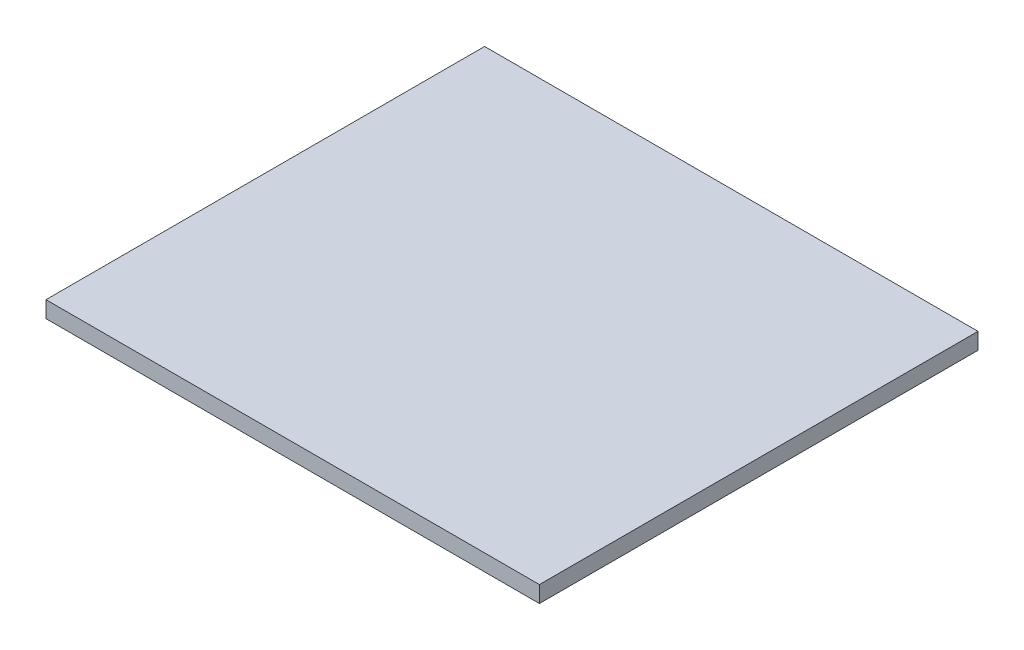
ISO-10303-21;
HEADER;
FILE_DESCRIPTION(('STEP AP214'),'2;1');
FILE_NAME('part.step','',(''),(''),'','','');
FILE_SCHEMA(('AUTOMOTIVE_DESIGN { 1 0 10303 214 1 1 1 1 }'));
ENDSEC;
DATA;
#1=APPLICATION_CONTEXT('core data for automotive mechanical design processes');
#2=APPLICATION_PROTOCOL_DEFINITION('international standard','automotive_design',2000,#1);
#3=PRODUCT_CONTEXT('',#1,'mechanical');
#4=PRODUCT('Part','Part','',(#3));
#5=PRODUCT_RELATED_PRODUCT_CATEGORY('part','',(#4));
#6=PRODUCT_DEFINITION_FORMATION('','',#4);
#7=PRODUCT_DEFINITION_CONTEXT('part definition',#1,'design');
#8=PRODUCT_DEFINITION('design','',#6,#7);
#9=PRODUCT_DEFINITION_SHAPE('','',#8);
#10=(LENGTH_UNIT() NAMED_UNIT(*) SI_UNIT(.MILLI.,.METRE.));
#11=(NAMED_UNIT(*) PLANE_ANGLE_UNIT() SI_UNIT($,.RADIAN.));
#12=(NAMED_UNIT(*) SI_UNIT($,.STERADIAN.) SOLID_ANGLE_UNIT());
#13=UNCERTAINTY_MEASURE_WITH_UNIT(LENGTH_MEASURE(1.E-05),#10,'distance_accuracy_value','');
#14=(GEOMETRIC_REPRESENTATION_CONTEXT(3) GLOBAL_UNCERTAINTY_ASSIGNED_CONTEXT((#13)) GLOBAL_UNIT_ASSIGNED_CONTEXT((#10,
#11,#12)) REPRESENTATION_CONTEXT('',''));
#15=CARTESIAN_POINT('',(0.,0.,0.));
#16=DIRECTION('',(0.,0.,1.));
#17=DIRECTION('',(1.,0.,0.));
#18=AXIS2_PLACEMENT_3D('',#15,#16,#17);
#19=CARTESIAN_POINT('',(45.,3.,40.));
#20=DIRECTION('',(-1.,0.,0.));
#21=DIRECTION('',(0.,0.,1.));
#22=AXIS2_PLACEMENT_3D('',#19,#20,#21);
#23=PLANE('',#22);
#24=DIRECTION('',(0.,0.,-1.));
#25=VECTOR('',#24,1.);
#26=CARTESIAN_POINT('',(45.,0.,40.));
#27=LINE('',#26,#25);
#28=CARTESIAN_POINT('',(45.,0.,40.));
#29=VERTEX_POINT('',#28);
#30=CARTESIAN_POINT('',(45.,0.,-40.));
#31=VERTEX_POINT('',#30);
#32=EDGE_CURVE('E111',#29,#31,#27,.T.);
#33=ORIENTED_EDGE('',*,*,#32,.T.);
#34=DIRECTION('',(0.,-1.,0.));
#35=VECTOR('',#34,1.);
#36=CARTESIAN_POINT('',(45.,3.,-40.));
#37=LINE('',#36,#35);
#38=CARTESIAN_POINT('',(45.,3.,-40.));
#39=VERTEX_POINT('',#38);
#40=EDGE_CURVE('E11',#39,#31,#37,.T.);
#41=ORIENTED_EDGE('',*,*,#40,.F.);
#42=DIRECTION('',(0.,0.,-1.));
#43=VECTOR('',#42,1.);
#44=CARTESIAN_POINT('',(45.,3.,40.));
#45=LINE('',#44,#43);
#46=CARTESIAN_POINT('',(45.,3.,40.));
#47=VERTEX_POINT('',#46);
#48=EDGE_CURVE('E95',#47,#39,#45,.T.);
#49=ORIENTED_EDGE('',*,*,#48,.F.);
#50=DIRECTION('',(0.,-1.,0.));
#51=VECTOR('',#50,1.);
#52=CARTESIAN_POINT('',(45.,3.,40.));
#53=LINE('',#52,#51);
#54=EDGE_CURVE('E107',#47,#29,#53,.T.);
#55=ORIENTED_EDGE('',*,*,#54,.T.);
#56=EDGE_LOOP('',(#33,#41,#49,#55));
#57=FACE_BOUND('',#56,.T.);
#58=ADVANCED_FACE('F43',(#57),#23,.F.);
#59=CARTESIAN_POINT('',(-45.,3.,-40.));
#60=DIRECTION('',(0.,0.,1.));
#61=DIRECTION('',(1.,0.,0.));
#62=AXIS2_PLACEMENT_3D('',#59,#60,#61);
#63=PLANE('',#62);
#64=DIRECTION('',(-1.,0.,0.));
#65=VECTOR('',#64,1.);
#66=CARTESIAN_POINT('',(-45.,0.,-40.));
#67=LINE('',#66,#65);
#68=CARTESIAN_POINT('',(-45.,0.,-40.));
#69=VERTEX_POINT('',#68);
#70=EDGE_CURVE('E100',#31,#69,#67,.T.);
#71=ORIENTED_EDGE('',*,*,#70,.T.);
#72=DIRECTION('',(0.,-1.,0.));
#73=VECTOR('',#72,1.);
#74=CARTESIAN_POINT('',(-45.,3.,-40.));
#75=LINE('',#74,#73);
#76=CARTESIAN_POINT('',(-45.,3.,-40.));
#77=VERTEX_POINT('',#76);
#78=EDGE_CURVE('E52',#77,#69,#75,.T.);
#79=ORIENTED_EDGE('',*,*,#78,.F.);
#80=DIRECTION('',(-1.,0.,0.));
#81=VECTOR('',#80,1.);
#82=CARTESIAN_POINT('',(-45.,3.,-40.));
#83=LINE('',#82,#81);
#84=EDGE_CURVE('E90',#39,#77,#83,.T.);
#85=ORIENTED_EDGE('',*,*,#84,.F.);
#86=ORIENTED_EDGE('',*,*,#40,.T.);
#87=EDGE_LOOP('',(#71,#79,#85,#86));
#88=FACE_BOUND('',#87,.T.);
#89=ADVANCED_FACE('F99',(#88),#63,.F.);
#90=CARTESIAN_POINT('',(-45.,3.,40.));
#91=DIRECTION('',(1.,0.,0.));
#92=DIRECTION('',(0.,0.,-1.));
#93=AXIS2_PLACEMENT_3D('',#90,#91,#92);
#94=PLANE('',#93);
#95=DIRECTION('',(0.,0.,1.));
#96=VECTOR('',#95,1.);
#97=CARTESIAN_POINT('',(-45.,0.,40.));
#98=LINE('',#97,#96);
#99=CARTESIAN_POINT('',(-45.,0.,40.));
#100=VERTEX_POINT('',#99);
#101=EDGE_CURVE('E77',#69,#100,#98,.T.);
#102=ORIENTED_EDGE('',*,*,#101,.T.);
#103=DIRECTION('',(0.,-1.,0.));
#104=VECTOR('',#103,1.);
#105=CARTESIAN_POINT('',(-45.,3.,40.));
#106=LINE('',#105,#104);
#107=CARTESIAN_POINT('',(-45.,3.,40.));
#108=VERTEX_POINT('',#107);
#109=EDGE_CURVE('E102',#108,#100,#106,.T.);
#110=ORIENTED_EDGE('',*,*,#109,.F.);
#111=DIRECTION('',(0.,0.,1.));
#112=VECTOR('',#111,1.);
#113=CARTESIAN_POINT('',(-45.,3.,40.));
#114=LINE('',#113,#112);
#115=EDGE_CURVE('E93',#77,#108,#114,.T.);
#116=ORIENTED_EDGE('',*,*,#115,.F.);
#117=ORIENTED_EDGE('',*,*,#78,.T.);
#118=EDGE_LOOP('',(#102,#110,#116,#117));
#119=FACE_BOUND('',#118,.T.);
#120=ADVANCED_FACE('F103',(#119),#94,.F.);
#121=CARTESIAN_POINT('',(-45.,3.,40.));
#122=DIRECTION('',(0.,0.,-1.));
#123=DIRECTION('',(-1.,0.,0.));
#124=AXIS2_PLACEMENT_3D('',#121,#122,#123);
#125=PLANE('',#124);
#126=DIRECTION('',(1.,0.,0.));
#127=VECTOR('',#126,1.);
#128=CARTESIAN_POINT('',(-45.,0.,40.));
#129=LINE('',#128,#127);
#130=EDGE_CURVE('E83',#100,#29,#129,.T.);
#131=ORIENTED_EDGE('',*,*,#130,.T.);
#132=ORIENTED_EDGE('',*,*,#54,.F.);
#133=DIRECTION('',(1.,0.,0.));
#134=VECTOR('',#133,1.);
#135=CARTESIAN_POINT('',(-45.,3.,40.));
#136=LINE('',#135,#134);
#137=EDGE_CURVE('E60',#108,#47,#136,.T.);
#138=ORIENTED_EDGE('',*,*,#137,.F.);
#139=ORIENTED_EDGE('',*,*,#109,.T.);
#140=EDGE_LOOP('',(#131,#132,#138,#139));
#141=FACE_BOUND('',#140,.T.);
#142=ADVANCED_FACE('F124',(#141),#125,.F.);
#143=CARTESIAN_POINT('',(0.,3.,0.));
#144=DIRECTION('',(0.,-1.,0.));
#145=DIRECTION('',(0.,0.,-1.));
#146=AXIS2_PLACEMENT_3D('',#143,#144,#145);
#147=PLANE('',#146);
#148=ORIENTED_EDGE('',*,*,#48,.T.);
#149=ORIENTED_EDGE('',*,*,#84,.T.);
#150=ORIENTED_EDGE('',*,*,#115,.T.);
#151=ORIENTED_EDGE('',*,*,#137,.T.);
#152=EDGE_LOOP('',(#148,#149,#150,#151));
#153=FACE_BOUND('',#152,.T.);
#154=ADVANCED_FACE('F91',(#153),#147,.F.);
#155=CARTESIAN_POINT('',(0.,0.,0.));
#156=DIRECTION('',(0.,-1.,0.));
#157=DIRECTION('',(0.,0.,-1.));
#158=AXIS2_PLACEMENT_3D('',#155,#156,#157);
#159=PLANE('',#158);
#160=ORIENTED_EDGE('',*,*,#32,.F.);
#161=ORIENTED_EDGE('',*,*,#130,.F.);
#162=ORIENTED_EDGE('',*,*,#101,.F.);
#163=ORIENTED_EDGE('',*,*,#70,.F.);
#164=EDGE_LOOP('',(#160,#161,#162,#163));
#165=FACE_BOUND('',#164,.T.);
#166=ADVANCED_FACE('F127',(#165),#159,.T.);
#167=CLOSED_SHELL('',(#58,#89,#120,#142,#154,#166));
#168=MANIFOLD_SOLID_BREP('B2',#167);
#169=ADVANCED_BREP_SHAPE_REPRESENTATION('',(#18,#168),#14);
#170=SHAPE_DEFINITION_REPRESENTATION(#9,#169);
ENDSEC;
END-ISO-10303-21;
